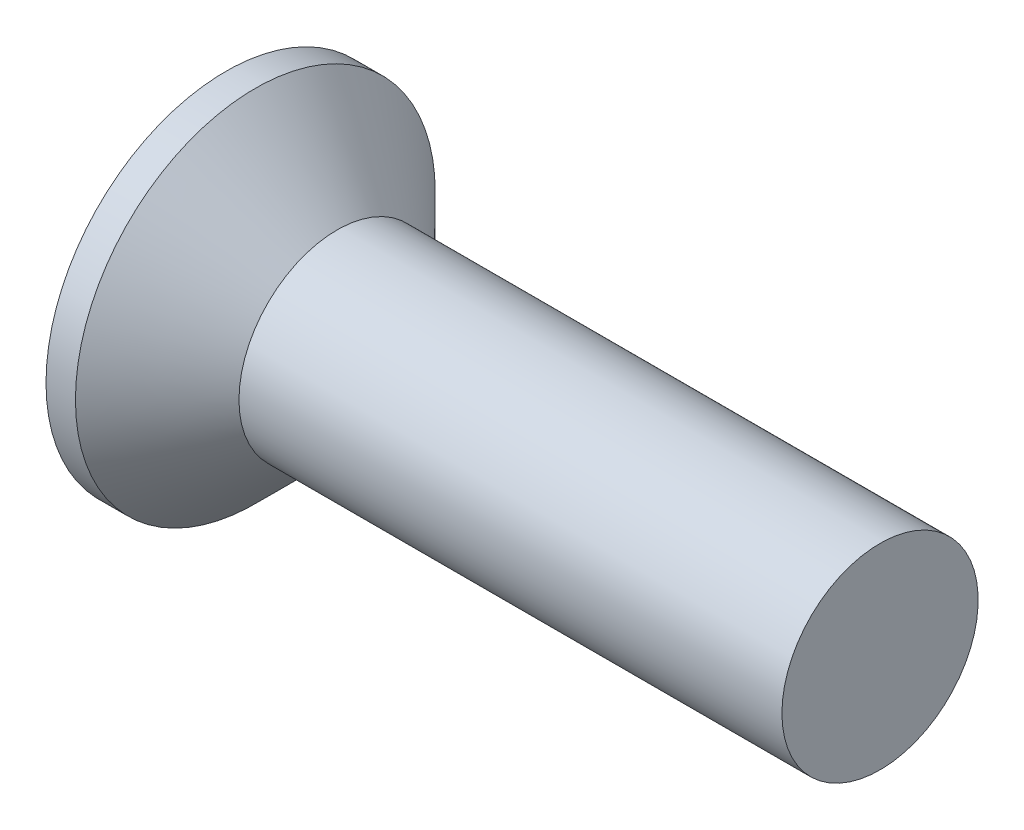
ISO-10303-21;
HEADER;
FILE_DESCRIPTION(('STEP AP214'),'2;1');
FILE_NAME('part.step','',(''),(''),'','','');
FILE_SCHEMA(('AUTOMOTIVE_DESIGN { 1 0 10303 214 1 1 1 1 }'));
ENDSEC;
DATA;
#1=APPLICATION_CONTEXT('core data for automotive mechanical design processes');
#2=APPLICATION_PROTOCOL_DEFINITION('international standard','automotive_design',2000,#1);
#3=PRODUCT_CONTEXT('',#1,'mechanical');
#4=PRODUCT('Part','Part','',(#3));
#5=PRODUCT_RELATED_PRODUCT_CATEGORY('part','',(#4));
#6=PRODUCT_DEFINITION_FORMATION('','',#4);
#7=PRODUCT_DEFINITION_CONTEXT('part definition',#1,'design');
#8=PRODUCT_DEFINITION('design','',#6,#7);
#9=PRODUCT_DEFINITION_SHAPE('','',#8);
#10=(LENGTH_UNIT() NAMED_UNIT(*) SI_UNIT(.MILLI.,.METRE.));
#11=(NAMED_UNIT(*) PLANE_ANGLE_UNIT() SI_UNIT($,.RADIAN.));
#12=(NAMED_UNIT(*) SI_UNIT($,.STERADIAN.) SOLID_ANGLE_UNIT());
#13=UNCERTAINTY_MEASURE_WITH_UNIT(LENGTH_MEASURE(1.E-05),#10,'distance_accuracy_value','');
#14=(GEOMETRIC_REPRESENTATION_CONTEXT(3) GLOBAL_UNCERTAINTY_ASSIGNED_CONTEXT((#13)) GLOBAL_UNIT_ASSIGNED_CONTEXT((#10,
#11,#12)) REPRESENTATION_CONTEXT('',''));
#15=CARTESIAN_POINT('',(0.,0.,0.));
#16=DIRECTION('',(0.,0.,1.));
#17=DIRECTION('',(1.,0.,0.));
#18=AXIS2_PLACEMENT_3D('',#15,#16,#17);
#19=CARTESIAN_POINT('',(0.,0.,0.));
#20=DIRECTION('',(-1.,0.,0.));
#21=DIRECTION('',(0.,0.,1.));
#22=AXIS2_PLACEMENT_3D('',#19,#20,#21);
#23=PLANE('',#22);
#24=CARTESIAN_POINT('',(0.,0.,0.));
#25=DIRECTION('',(-1.,0.,0.));
#26=DIRECTION('',(0.,0.,1.));
#27=AXIS2_PLACEMENT_3D('',#24,#25,#26);
#28=CIRCLE('',#27,2.75);
#29=CARTESIAN_POINT('',(0.,0.,2.75));
#30=VERTEX_POINT('',#29);
#31=EDGE_CURVE('E41',#30,#30,#28,.T.);
#32=ORIENTED_EDGE('',*,*,#31,.T.);
#33=EDGE_LOOP('',(#32));
#34=FACE_BOUND('',#33,.T.);
#35=DIRECTION('',(0.,1.,0.));
#36=VECTOR('',#35,1.);
#37=CARTESIAN_POINT('',(0.,-1.55,-0.395));
#38=LINE('',#37,#36);
#39=CARTESIAN_POINT('',(0.,-1.55,-0.395));
#40=VERTEX_POINT('',#39);
#41=CARTESIAN_POINT('',(0.,-0.394999999999999,-0.395));
#42=VERTEX_POINT('',#41);
#43=EDGE_CURVE('E102',#40,#42,#38,.T.);
#44=ORIENTED_EDGE('',*,*,#43,.T.);
#45=DIRECTION('',(0.,0.,-1.));
#46=VECTOR('',#45,1.);
#47=CARTESIAN_POINT('',(0.,-0.395000000000005,1.55));
#48=LINE('',#47,#46);
#49=CARTESIAN_POINT('',(0.,-0.394999999999995,-1.55));
#50=VERTEX_POINT('',#49);
#51=EDGE_CURVE('E82',#42,#50,#48,.T.);
#52=ORIENTED_EDGE('',*,*,#51,.T.);
#53=DIRECTION('',(0.,1.,0.));
#54=VECTOR('',#53,1.);
#55=CARTESIAN_POINT('',(0.,-0.394999999999995,-1.55));
#56=LINE('',#55,#54);
#57=CARTESIAN_POINT('',(0.,0.395000000000005,-1.55));
#58=VERTEX_POINT('',#57);
#59=EDGE_CURVE('E339',#50,#58,#56,.T.);
#60=ORIENTED_EDGE('',*,*,#59,.T.);
#61=DIRECTION('',(0.,0.,1.));
#62=VECTOR('',#61,1.);
#63=CARTESIAN_POINT('',(0.,0.395000000000005,-1.55));
#64=LINE('',#63,#62);
#65=CARTESIAN_POINT('',(0.,0.395000000000001,-0.395));
#66=VERTEX_POINT('',#65);
#67=EDGE_CURVE('E98',#58,#66,#64,.T.);
#68=ORIENTED_EDGE('',*,*,#67,.T.);
#69=CARTESIAN_POINT('',(0.,1.55,-0.395));
#70=VERTEX_POINT('',#69);
#71=EDGE_CURVE('E92',#66,#70,#38,.T.);
#72=ORIENTED_EDGE('',*,*,#71,.T.);
#73=DIRECTION('',(0.,0.,1.));
#74=VECTOR('',#73,1.);
#75=CARTESIAN_POINT('',(0.,1.55,-0.395));
#76=LINE('',#75,#74);
#77=CARTESIAN_POINT('',(0.,1.55,0.395));
#78=VERTEX_POINT('',#77);
#79=EDGE_CURVE('E95',#70,#78,#76,.T.);
#80=ORIENTED_EDGE('',*,*,#79,.T.);
#81=DIRECTION('',(0.,-1.,0.));
#82=VECTOR('',#81,1.);
#83=CARTESIAN_POINT('',(0.,1.55,0.395));
#84=LINE('',#83,#82);
#85=CARTESIAN_POINT('',(0.,0.394999999999998,0.395));
#86=VERTEX_POINT('',#85);
#87=EDGE_CURVE('E351',#78,#86,#84,.T.);
#88=ORIENTED_EDGE('',*,*,#87,.T.);
#89=CARTESIAN_POINT('',(0.,0.394999999999994,1.55));
#90=VERTEX_POINT('',#89);
#91=EDGE_CURVE('E334',#86,#90,#64,.T.);
#92=ORIENTED_EDGE('',*,*,#91,.T.);
#93=DIRECTION('',(0.,-1.,0.));
#94=VECTOR('',#93,1.);
#95=CARTESIAN_POINT('',(0.,0.394999999999994,1.55));
#96=LINE('',#95,#94);
#97=CARTESIAN_POINT('',(0.,-0.395000000000005,1.55));
#98=VERTEX_POINT('',#97);
#99=EDGE_CURVE('E320',#90,#98,#96,.T.);
#100=ORIENTED_EDGE('',*,*,#99,.T.);
#101=CARTESIAN_POINT('',(0.,-0.395000000000001,0.395));
#102=VERTEX_POINT('',#101);
#103=EDGE_CURVE('E332',#98,#102,#48,.T.);
#104=ORIENTED_EDGE('',*,*,#103,.T.);
#105=CARTESIAN_POINT('',(0.,-1.55,0.395));
#106=VERTEX_POINT('',#105);
#107=EDGE_CURVE('E108',#102,#106,#84,.T.);
#108=ORIENTED_EDGE('',*,*,#107,.T.);
#109=DIRECTION('',(0.,0.,-1.));
#110=VECTOR('',#109,1.);
#111=CARTESIAN_POINT('',(0.,-1.55,0.395));
#112=LINE('',#111,#110);
#113=EDGE_CURVE('E131',#106,#40,#112,.T.);
#114=ORIENTED_EDGE('',*,*,#113,.T.);
#115=EDGE_LOOP('',(#44,#52,#60,#68,#72,#80,#88,#92,#100,#104,#108,#114));
#116=FACE_BOUND('',#115,.T.);
#117=ADVANCED_FACE('F34',(#34,#116),#23,.T.);
#118=CARTESIAN_POINT('',(2.38373382624769,0.,0.16865988909427));
#119=DIRECTION('',(-0.0945267588569114,0.,-0.995522321125954));
#120=DIRECTION('',(-0.995522321125954,0.,0.0945267588569114));
#121=AXIS2_PLACEMENT_3D('',#118,#119,#120);
#122=PLANE('',#121);
#123=ORIENTED_EDGE('',*,*,#107,.F.);
#124=DIRECTION('',(0.991104257398676,0.0941072552097303,-0.09410725520973));
#125=VECTOR('',#124,1.);
#126=CARTESIAN_POINT('',(2.39946475118715,-0.16716620751949,0.167166207519489));
#127=LINE('',#126,#125);
#128=CARTESIAN_POINT('',(2.08,-0.197500000000001,0.197499999999999));
#129=VERTEX_POINT('',#128);
#130=EDGE_CURVE('E126',#102,#129,#127,.T.);
#131=ORIENTED_EDGE('',*,*,#130,.T.);
#132=DIRECTION('',(0.835707904588478,0.543411029305728,-0.0793520726712616));
#133=VECTOR('',#132,1.);
#134=CARTESIAN_POINT('',(0.,-1.55,0.395));
#135=LINE('',#134,#133);
#136=EDGE_CURVE('E103',#106,#129,#135,.T.);
#137=ORIENTED_EDGE('',*,*,#136,.F.);
#138=EDGE_LOOP('',(#123,#131,#137));
#139=FACE_BOUND('',#138,.T.);
#140=ADVANCED_FACE('F154',(#139),#122,.T.);
#141=DIRECTION('',(0.835707904588477,-0.543411029305729,-0.0793520726712615));
#142=VECTOR('',#141,1.);
#143=CARTESIAN_POINT('',(0.,1.55,0.395));
#144=LINE('',#143,#142);
#145=CARTESIAN_POINT('',(2.08,0.1975,0.1975));
#146=VERTEX_POINT('',#145);
#147=EDGE_CURVE('E48',#78,#146,#144,.T.);
#148=ORIENTED_EDGE('',*,*,#147,.T.);
#149=DIRECTION('',(-0.991104257398676,0.0941072552097295,0.0941072552097299));
#150=VECTOR('',#149,1.);
#151=CARTESIAN_POINT('',(2.39946475118715,0.167166207519489,0.167166207519489));
#152=LINE('',#151,#150);
#153=EDGE_CURVE('E347',#146,#86,#152,.T.);
#154=ORIENTED_EDGE('',*,*,#153,.T.);
#155=ORIENTED_EDGE('',*,*,#87,.F.);
#156=EDGE_LOOP('',(#148,#154,#155));
#157=FACE_BOUND('',#156,.T.);
#158=ADVANCED_FACE('F158',(#157),#122,.T.);
#159=CARTESIAN_POINT('',(2.38373382624769,0.,-0.16865988909427));
#160=DIRECTION('',(-0.0945267588569113,0.,0.995522321125954));
#161=DIRECTION('',(0.995522321125954,0.,0.0945267588569113));
#162=AXIS2_PLACEMENT_3D('',#159,#160,#161);
#163=PLANE('',#162);
#164=DIRECTION('',(0.835707904588478,0.543411029305728,0.0793520726712615));
#165=VECTOR('',#164,1.);
#166=CARTESIAN_POINT('',(0.,-1.55,-0.395));
#167=LINE('',#166,#165);
#168=CARTESIAN_POINT('',(2.08,-0.1975,-0.197500000000001));
#169=VERTEX_POINT('',#168);
#170=EDGE_CURVE('E57',#40,#169,#167,.T.);
#171=ORIENTED_EDGE('',*,*,#170,.T.);
#172=DIRECTION('',(-0.991104257398676,-0.0941072552097296,-0.0941072552097298));
#173=VECTOR('',#172,1.);
#174=CARTESIAN_POINT('',(2.39946475118715,-0.167166207519489,-0.167166207519489));
#175=LINE('',#174,#173);
#176=EDGE_CURVE('E11',#169,#42,#175,.T.);
#177=ORIENTED_EDGE('',*,*,#176,.T.);
#178=ORIENTED_EDGE('',*,*,#43,.F.);
#179=EDGE_LOOP('',(#171,#177,#178));
#180=FACE_BOUND('',#179,.T.);
#181=ADVANCED_FACE('F151',(#180),#163,.T.);
#182=ORIENTED_EDGE('',*,*,#71,.F.);
#183=DIRECTION('',(0.991104257398676,-0.0941072552097302,0.0941072552097298));
#184=VECTOR('',#183,1.);
#185=CARTESIAN_POINT('',(2.39946475118715,0.16716620751949,-0.167166207519489));
#186=LINE('',#185,#184);
#187=CARTESIAN_POINT('',(2.08,0.1975,-0.1975));
#188=VERTEX_POINT('',#187);
#189=EDGE_CURVE('E111',#66,#188,#186,.T.);
#190=ORIENTED_EDGE('',*,*,#189,.T.);
#191=DIRECTION('',(0.835707904588477,-0.543411029305729,0.0793520726712615));
#192=VECTOR('',#191,1.);
#193=CARTESIAN_POINT('',(0.,1.55,-0.395));
#194=LINE('',#193,#192);
#195=EDGE_CURVE('E107',#70,#188,#194,.T.);
#196=ORIENTED_EDGE('',*,*,#195,.F.);
#197=EDGE_LOOP('',(#182,#190,#196));
#198=FACE_BOUND('',#197,.T.);
#199=ADVANCED_FACE('F110',(#198),#163,.T.);
#200=CARTESIAN_POINT('',(-6.34999999999999,0.,0.));
#201=DIRECTION('',(-1.,0.,0.));
#202=DIRECTION('',(0.,0.,1.));
#203=AXIS2_PLACEMENT_3D('',#200,#201,#202);
#204=CYLINDRICAL_SURFACE('',#203,2.75);
#205=CARTESIAN_POINT('',(0.450000000000004,0.,0.));
#206=DIRECTION('',(-1.,0.,0.));
#207=DIRECTION('',(0.,0.,1.));
#208=AXIS2_PLACEMENT_3D('',#205,#206,#207);
#209=CIRCLE('',#208,2.75);
#210=CARTESIAN_POINT('',(0.450000000000004,0.,2.75));
#211=VERTEX_POINT('',#210);
#212=EDGE_CURVE('E134',#211,#211,#209,.T.);
#213=ORIENTED_EDGE('',*,*,#212,.T.);
#214=EDGE_LOOP('',(#213));
#215=FACE_BOUND('',#214,.T.);
#216=ORIENTED_EDGE('',*,*,#31,.F.);
#217=EDGE_LOOP('',(#216));
#218=FACE_BOUND('',#217,.T.);
#219=ADVANCED_FACE('F140',(#215,#218),#204,.T.);
#220=CARTESIAN_POINT('',(0.450000000000004,0.,0.));
#221=DIRECTION('',(-1.,0.,0.));
#222=DIRECTION('',(0.,0.,1.));
#223=AXIS2_PLACEMENT_3D('',#220,#221,#222);
#224=CONICAL_SURFACE('',#223,2.75,0.78539816339745);
#225=CARTESIAN_POINT('',(1.7,0.,0.));
#226=DIRECTION('',(-1.,0.,0.));
#227=DIRECTION('',(0.,0.,1.));
#228=AXIS2_PLACEMENT_3D('',#225,#226,#227);
#229=CIRCLE('',#228,1.5);
#230=CARTESIAN_POINT('',(1.7,0.,1.5));
#231=VERTEX_POINT('',#230);
#232=EDGE_CURVE('E130',#231,#231,#229,.T.);
#233=ORIENTED_EDGE('',*,*,#232,.T.);
#234=EDGE_LOOP('',(#233));
#235=FACE_BOUND('',#234,.T.);
#236=ORIENTED_EDGE('',*,*,#212,.F.);
#237=EDGE_LOOP('',(#236));
#238=FACE_BOUND('',#237,.T.);
#239=ADVANCED_FACE('F142',(#235,#238),#224,.T.);
#240=CARTESIAN_POINT('',(-6.34999999999999,0.,0.));
#241=DIRECTION('',(-1.,0.,0.));
#242=DIRECTION('',(0.,0.,1.));
#243=AXIS2_PLACEMENT_3D('',#240,#241,#242);
#244=CYLINDRICAL_SURFACE('',#243,1.5);
#245=CARTESIAN_POINT('',(10.,0.,0.));
#246=DIRECTION('',(-1.,0.,0.));
#247=DIRECTION('',(0.,0.,1.));
#248=AXIS2_PLACEMENT_3D('',#245,#246,#247);
#249=CIRCLE('',#248,1.5);
#250=CARTESIAN_POINT('',(10.,0.,1.5));
#251=VERTEX_POINT('',#250);
#252=EDGE_CURVE('E127',#251,#251,#249,.T.);
#253=ORIENTED_EDGE('',*,*,#252,.T.);
#254=EDGE_LOOP('',(#253));
#255=FACE_BOUND('',#254,.T.);
#256=ORIENTED_EDGE('',*,*,#232,.F.);
#257=EDGE_LOOP('',(#256));
#258=FACE_BOUND('',#257,.T.);
#259=ADVANCED_FACE('F148',(#255,#258),#244,.T.);
#260=CARTESIAN_POINT('',(10.,1.5,0.));
#261=DIRECTION('',(1.,0.,0.));
#262=DIRECTION('',(0.,0.,-1.));
#263=AXIS2_PLACEMENT_3D('',#260,#261,#262);
#264=PLANE('',#263);
#265=ORIENTED_EDGE('',*,*,#252,.F.);
#266=EDGE_LOOP('',(#265));
#267=FACE_BOUND('',#266,.T.);
#268=ADVANCED_FACE('F178',(#267),#264,.T.);
#269=CARTESIAN_POINT('',(2.08,0.1975,-0.1975));
#270=DIRECTION('',(1.,0.,0.));
#271=DIRECTION('',(0.,0.,-1.));
#272=AXIS2_PLACEMENT_3D('',#269,#270,#271);
#273=PLANE('',#272);
#274=DIRECTION('',(0.,1.,0.));
#275=VECTOR('',#274,1.);
#276=CARTESIAN_POINT('',(2.08,-0.1975,-0.1975));
#277=LINE('',#276,#275);
#278=EDGE_CURVE('E122',#169,#188,#277,.T.);
#279=ORIENTED_EDGE('',*,*,#278,.F.);
#280=DIRECTION('',(0.,0.,-1.));
#281=VECTOR('',#280,1.);
#282=CARTESIAN_POINT('',(2.08,-0.1975,0.1975));
#283=LINE('',#282,#281);
#284=EDGE_CURVE('E113',#129,#169,#283,.T.);
#285=ORIENTED_EDGE('',*,*,#284,.F.);
#286=DIRECTION('',(0.,-1.,0.));
#287=VECTOR('',#286,1.);
#288=CARTESIAN_POINT('',(2.08,0.1975,0.1975));
#289=LINE('',#288,#287);
#290=EDGE_CURVE('E116',#146,#129,#289,.T.);
#291=ORIENTED_EDGE('',*,*,#290,.F.);
#292=DIRECTION('',(0.,0.,1.));
#293=VECTOR('',#292,1.);
#294=CARTESIAN_POINT('',(2.08,0.1975,-0.1975));
#295=LINE('',#294,#293);
#296=EDGE_CURVE('E120',#188,#146,#295,.T.);
#297=ORIENTED_EDGE('',*,*,#296,.F.);
#298=EDGE_LOOP('',(#279,#285,#291,#297));
#299=FACE_BOUND('',#298,.T.);
#300=ADVANCED_FACE('F175',(#299),#273,.F.);
#301=CARTESIAN_POINT('',(2.08,-0.1975,-0.1975));
#302=DIRECTION('',(-0.54513001368185,0.838351518268576,0.));
#303=DIRECTION('',(-0.838351518268576,-0.54513001368185,0.));
#304=AXIS2_PLACEMENT_3D('',#301,#302,#303);
#305=PLANE('',#304);
#306=ORIENTED_EDGE('',*,*,#170,.F.);
#307=ORIENTED_EDGE('',*,*,#113,.F.);
#308=ORIENTED_EDGE('',*,*,#136,.T.);
#309=ORIENTED_EDGE('',*,*,#284,.T.);
#310=EDGE_LOOP('',(#306,#307,#308,#309));
#311=FACE_BOUND('',#310,.T.);
#312=ADVANCED_FACE('F167',(#311),#305,.T.);
#313=CARTESIAN_POINT('',(0.,1.55,0.395));
#314=DIRECTION('',(-0.54513001368185,-0.838351518268575,0.));
#315=DIRECTION('',(0.838351518268576,-0.54513001368185,0.));
#316=AXIS2_PLACEMENT_3D('',#313,#314,#315);
#317=PLANE('',#316);
#318=ORIENTED_EDGE('',*,*,#147,.F.);
#319=ORIENTED_EDGE('',*,*,#79,.F.);
#320=ORIENTED_EDGE('',*,*,#195,.T.);
#321=ORIENTED_EDGE('',*,*,#296,.T.);
#322=EDGE_LOOP('',(#318,#319,#320,#321));
#323=FACE_BOUND('',#322,.T.);
#324=ADVANCED_FACE('F106',(#323),#317,.T.);
#325=CARTESIAN_POINT('',(2.38373382624769,-0.16865988909427,0.));
#326=DIRECTION('',(-0.0945267588569114,0.995522321125954,0.));
#327=DIRECTION('',(-0.995522321125954,-0.0945267588569114,0.));
#328=AXIS2_PLACEMENT_3D('',#325,#326,#327);
#329=PLANE('',#328);
#330=DIRECTION('',(0.835707904588478,0.0793520726712597,0.543411029305728));
#331=VECTOR('',#330,1.);
#332=CARTESIAN_POINT('',(0.,-0.394999999999995,-1.55));
#333=LINE('',#332,#331);
#334=EDGE_CURVE('E341',#50,#169,#333,.T.);
#335=ORIENTED_EDGE('',*,*,#334,.F.);
#336=ORIENTED_EDGE('',*,*,#51,.F.);
#337=ORIENTED_EDGE('',*,*,#176,.F.);
#338=EDGE_LOOP('',(#335,#336,#337));
#339=FACE_BOUND('',#338,.T.);
#340=ADVANCED_FACE('F174',(#339),#329,.T.);
#341=CARTESIAN_POINT('',(2.38373382624769,0.16865988909427,0.));
#342=DIRECTION('',(-0.0945267588569113,-0.995522321125954,0.));
#343=DIRECTION('',(0.995522321125954,-0.0945267588569113,0.));
#344=AXIS2_PLACEMENT_3D('',#341,#342,#343);
#345=PLANE('',#344);
#346=ORIENTED_EDGE('',*,*,#67,.F.);
#347=DIRECTION('',(0.835707904588478,-0.0793520726712634,0.543411029305728));
#348=VECTOR('',#347,1.);
#349=CARTESIAN_POINT('',(0.,0.395000000000005,-1.55));
#350=LINE('',#349,#348);
#351=EDGE_CURVE('E73',#58,#188,#350,.T.);
#352=ORIENTED_EDGE('',*,*,#351,.T.);
#353=ORIENTED_EDGE('',*,*,#189,.F.);
#354=EDGE_LOOP('',(#346,#352,#353));
#355=FACE_BOUND('',#354,.T.);
#356=ADVANCED_FACE('F218',(#355),#345,.T.);
#357=CARTESIAN_POINT('',(2.08,0.197500000000001,-0.197499999999999));
#358=DIRECTION('',(-0.54513001368185,0.,0.838351518268576));
#359=DIRECTION('',(-0.838351518268576,0.,-0.54513001368185));
#360=AXIS2_PLACEMENT_3D('',#357,#358,#359);
#361=PLANE('',#360);
#362=ORIENTED_EDGE('',*,*,#351,.F.);
#363=ORIENTED_EDGE('',*,*,#59,.F.);
#364=ORIENTED_EDGE('',*,*,#334,.T.);
#365=ORIENTED_EDGE('',*,*,#278,.T.);
#366=EDGE_LOOP('',(#362,#363,#364,#365));
#367=FACE_BOUND('',#366,.T.);
#368=ADVANCED_FACE('F226',(#367),#361,.T.);
#369=ORIENTED_EDGE('',*,*,#103,.F.);
#370=DIRECTION('',(0.835707904588477,0.0793520726712634,-0.543411029305728));
#371=VECTOR('',#370,1.);
#372=CARTESIAN_POINT('',(0.,-0.395000000000005,1.55));
#373=LINE('',#372,#371);
#374=EDGE_CURVE('E317',#98,#129,#373,.T.);
#375=ORIENTED_EDGE('',*,*,#374,.T.);
#376=ORIENTED_EDGE('',*,*,#130,.F.);
#377=EDGE_LOOP('',(#369,#375,#376));
#378=FACE_BOUND('',#377,.T.);
#379=ADVANCED_FACE('F220',(#378),#329,.T.);
#380=DIRECTION('',(0.835707904588477,-0.0793520726712596,-0.543411029305729));
#381=VECTOR('',#380,1.);
#382=CARTESIAN_POINT('',(0.,0.394999999999994,1.55));
#383=LINE('',#382,#381);
#384=EDGE_CURVE('E328',#90,#146,#383,.T.);
#385=ORIENTED_EDGE('',*,*,#384,.F.);
#386=ORIENTED_EDGE('',*,*,#91,.F.);
#387=ORIENTED_EDGE('',*,*,#153,.F.);
#388=EDGE_LOOP('',(#385,#386,#387));
#389=FACE_BOUND('',#388,.T.);
#390=ADVANCED_FACE('F228',(#389),#345,.T.);
#391=CARTESIAN_POINT('',(0.,-0.395000000000005,1.55));
#392=DIRECTION('',(-0.54513001368185,0.,-0.838351518268575));
#393=DIRECTION('',(0.838351518268576,0.,-0.54513001368185));
#394=AXIS2_PLACEMENT_3D('',#391,#392,#393);
#395=PLANE('',#394);
#396=ORIENTED_EDGE('',*,*,#374,.F.);
#397=ORIENTED_EDGE('',*,*,#99,.F.);
#398=ORIENTED_EDGE('',*,*,#384,.T.);
#399=ORIENTED_EDGE('',*,*,#290,.T.);
#400=EDGE_LOOP('',(#396,#397,#398,#399));
#401=FACE_BOUND('',#400,.T.);
#402=ADVANCED_FACE('F247',(#401),#395,.T.);
#403=CLOSED_SHELL('',(#117,#140,#158,#181,#199,#219,#239,#259,#268,#300,#312,#324,#340,#356,
#368,#379,#390,#402));
#404=MANIFOLD_SOLID_BREP('B2',#403);
#405=ADVANCED_BREP_SHAPE_REPRESENTATION('',(#18,#404),#14);
#406=SHAPE_DEFINITION_REPRESENTATION(#9,#405);
ENDSEC;
END-ISO-10303-21;
